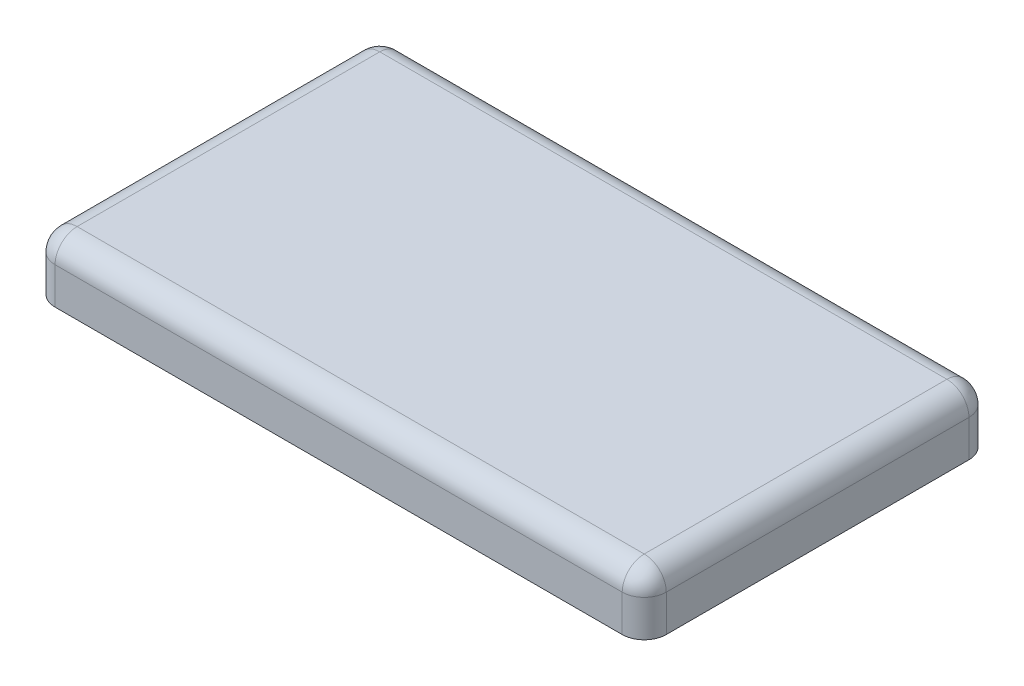
ISO-10303-21;
HEADER;
FILE_DESCRIPTION(('STEP AP214'),'2;1');
FILE_NAME('part.step','',(''),(''),'','','');
FILE_SCHEMA(('AUTOMOTIVE_DESIGN { 1 0 10303 214 1 1 1 1 }'));
ENDSEC;
DATA;
#1=APPLICATION_CONTEXT('core data for automotive mechanical design processes');
#2=APPLICATION_PROTOCOL_DEFINITION('international standard','automotive_design',2000,#1);
#3=PRODUCT_CONTEXT('',#1,'mechanical');
#4=PRODUCT('Part','Part','',(#3));
#5=PRODUCT_RELATED_PRODUCT_CATEGORY('part','',(#4));
#6=PRODUCT_DEFINITION_FORMATION('','',#4);
#7=PRODUCT_DEFINITION_CONTEXT('part definition',#1,'design');
#8=PRODUCT_DEFINITION('design','',#6,#7);
#9=PRODUCT_DEFINITION_SHAPE('','',#8);
#10=(LENGTH_UNIT() NAMED_UNIT(*) SI_UNIT(.MILLI.,.METRE.));
#11=(NAMED_UNIT(*) PLANE_ANGLE_UNIT() SI_UNIT($,.RADIAN.));
#12=(NAMED_UNIT(*) SI_UNIT($,.STERADIAN.) SOLID_ANGLE_UNIT());
#13=UNCERTAINTY_MEASURE_WITH_UNIT(LENGTH_MEASURE(1.E-05),#10,'distance_accuracy_value','');
#14=(GEOMETRIC_REPRESENTATION_CONTEXT(3) GLOBAL_UNCERTAINTY_ASSIGNED_CONTEXT((#13)) GLOBAL_UNIT_ASSIGNED_CONTEXT((#10,
#11,#12)) REPRESENTATION_CONTEXT('',''));
#15=CARTESIAN_POINT('',(0.,0.,0.));
#16=DIRECTION('',(0.,0.,1.));
#17=DIRECTION('',(1.,0.,0.));
#18=AXIS2_PLACEMENT_3D('',#15,#16,#17);
#19=CARTESIAN_POINT('',(0.,4.,0.));
#20=DIRECTION('',(1.,0.,0.));
#21=DIRECTION('',(0.,0.,-1.));
#22=AXIS2_PLACEMENT_3D('',#19,#20,#21);
#23=PLANE('',#22);
#24=DIRECTION('',(0.,0.,1.));
#25=VECTOR('',#24,1.);
#26=CARTESIAN_POINT('',(0.,0.,0.));
#27=LINE('',#26,#25);
#28=CARTESIAN_POINT('',(0.,0.,-22.1));
#29=VERTEX_POINT('',#28);
#30=CARTESIAN_POINT('',(0.,0.,-1.5));
#31=VERTEX_POINT('',#30);
#32=EDGE_CURVE('E175',#29,#31,#27,.T.);
#33=ORIENTED_EDGE('',*,*,#32,.T.);
#34=DIRECTION('',(0.,-1.,0.));
#35=VECTOR('',#34,1.);
#36=CARTESIAN_POINT('',(0.,4.,-1.5));
#37=LINE('',#36,#35);
#38=CARTESIAN_POINT('',(0.,2.5,-1.5));
#39=VERTEX_POINT('',#38);
#40=EDGE_CURVE('E51',#31,#39,#37,.F.);
#41=ORIENTED_EDGE('',*,*,#40,.T.);
#42=DIRECTION('',(0.,0.,1.));
#43=VECTOR('',#42,1.);
#44=CARTESIAN_POINT('',(0.,2.5,0.));
#45=LINE('',#44,#43);
#46=CARTESIAN_POINT('',(0.,2.5,-22.1));
#47=VERTEX_POINT('',#46);
#48=EDGE_CURVE('E56',#39,#47,#45,.F.);
#49=ORIENTED_EDGE('',*,*,#48,.T.);
#50=DIRECTION('',(0.,-1.,0.));
#51=VECTOR('',#50,1.);
#52=CARTESIAN_POINT('',(0.,4.,-22.1));
#53=LINE('',#52,#51);
#54=EDGE_CURVE('E217',#47,#29,#53,.T.);
#55=ORIENTED_EDGE('',*,*,#54,.T.);
#56=EDGE_LOOP('',(#33,#41,#49,#55));
#57=FACE_BOUND('',#56,.T.);
#58=ADVANCED_FACE('F34',(#57),#23,.F.);
#59=CARTESIAN_POINT('',(0.,4.,0.));
#60=DIRECTION('',(0.,0.,-1.));
#61=DIRECTION('',(-1.,0.,0.));
#62=AXIS2_PLACEMENT_3D('',#59,#60,#61);
#63=PLANE('',#62);
#64=DIRECTION('',(1.,0.,0.));
#65=VECTOR('',#64,1.);
#66=CARTESIAN_POINT('',(0.,2.5,0.));
#67=LINE('',#66,#65);
#68=CARTESIAN_POINT('',(40.1,2.5,0.));
#69=VERTEX_POINT('',#68);
#70=CARTESIAN_POINT('',(1.5,2.5,0.));
#71=VERTEX_POINT('',#70);
#72=EDGE_CURVE('E213',#69,#71,#67,.F.);
#73=ORIENTED_EDGE('',*,*,#72,.T.);
#74=DIRECTION('',(0.,-1.,0.));
#75=VECTOR('',#74,1.);
#76=CARTESIAN_POINT('',(1.5,4.,0.));
#77=LINE('',#76,#75);
#78=CARTESIAN_POINT('',(1.5,0.,0.));
#79=VERTEX_POINT('',#78);
#80=EDGE_CURVE('E215',#71,#79,#77,.T.);
#81=ORIENTED_EDGE('',*,*,#80,.T.);
#82=DIRECTION('',(1.,0.,0.));
#83=VECTOR('',#82,1.);
#84=CARTESIAN_POINT('',(0.,0.,0.));
#85=LINE('',#84,#83);
#86=CARTESIAN_POINT('',(40.1,0.,0.));
#87=VERTEX_POINT('',#86);
#88=EDGE_CURVE('E180',#79,#87,#85,.T.);
#89=ORIENTED_EDGE('',*,*,#88,.T.);
#90=DIRECTION('',(0.,-1.,0.));
#91=VECTOR('',#90,1.);
#92=CARTESIAN_POINT('',(40.1,4.,0.));
#93=LINE('',#92,#91);
#94=EDGE_CURVE('E211',#87,#69,#93,.F.);
#95=ORIENTED_EDGE('',*,*,#94,.T.);
#96=EDGE_LOOP('',(#73,#81,#89,#95));
#97=FACE_BOUND('',#96,.T.);
#98=ADVANCED_FACE('F282',(#97),#63,.F.);
#99=CARTESIAN_POINT('',(41.6,4.,0.));
#100=DIRECTION('',(-1.,0.,0.));
#101=DIRECTION('',(0.,0.,1.));
#102=AXIS2_PLACEMENT_3D('',#99,#100,#101);
#103=PLANE('',#102);
#104=DIRECTION('',(0.,0.,-1.));
#105=VECTOR('',#104,1.);
#106=CARTESIAN_POINT('',(41.6,0.,0.));
#107=LINE('',#106,#105);
#108=CARTESIAN_POINT('',(41.6,0.,-1.5));
#109=VERTEX_POINT('',#108);
#110=CARTESIAN_POINT('',(41.6,0.,-22.1));
#111=VERTEX_POINT('',#110);
#112=EDGE_CURVE('E183',#109,#111,#107,.T.);
#113=ORIENTED_EDGE('',*,*,#112,.T.);
#114=DIRECTION('',(0.,-1.,0.));
#115=VECTOR('',#114,1.);
#116=CARTESIAN_POINT('',(41.6,4.,-22.1));
#117=LINE('',#116,#115);
#118=CARTESIAN_POINT('',(41.6,2.5,-22.1));
#119=VERTEX_POINT('',#118);
#120=EDGE_CURVE('E209',#111,#119,#117,.F.);
#121=ORIENTED_EDGE('',*,*,#120,.T.);
#122=DIRECTION('',(0.,0.,-1.));
#123=VECTOR('',#122,1.);
#124=CARTESIAN_POINT('',(41.6,2.5,0.));
#125=LINE('',#124,#123);
#126=CARTESIAN_POINT('',(41.6,2.5,-1.5));
#127=VERTEX_POINT('',#126);
#128=EDGE_CURVE('E207',#119,#127,#125,.F.);
#129=ORIENTED_EDGE('',*,*,#128,.T.);
#130=DIRECTION('',(0.,-1.,0.));
#131=VECTOR('',#130,1.);
#132=CARTESIAN_POINT('',(41.6,4.,-1.5));
#133=LINE('',#132,#131);
#134=EDGE_CURVE('E205',#127,#109,#133,.T.);
#135=ORIENTED_EDGE('',*,*,#134,.T.);
#136=EDGE_LOOP('',(#113,#121,#129,#135));
#137=FACE_BOUND('',#136,.T.);
#138=ADVANCED_FACE('F315',(#137),#103,.F.);
#139=CARTESIAN_POINT('',(0.,4.,-23.6));
#140=DIRECTION('',(0.,0.,1.));
#141=DIRECTION('',(1.,0.,0.));
#142=AXIS2_PLACEMENT_3D('',#139,#140,#141);
#143=PLANE('',#142);
#144=DIRECTION('',(-1.,0.,0.));
#145=VECTOR('',#144,1.);
#146=CARTESIAN_POINT('',(0.,0.,-23.6));
#147=LINE('',#146,#145);
#148=CARTESIAN_POINT('',(40.1,0.,-23.6));
#149=VERTEX_POINT('',#148);
#150=CARTESIAN_POINT('',(1.49999999999999,0.,-23.6));
#151=VERTEX_POINT('',#150);
#152=EDGE_CURVE('E186',#149,#151,#147,.T.);
#153=ORIENTED_EDGE('',*,*,#152,.T.);
#154=DIRECTION('',(0.,-1.,0.));
#155=VECTOR('',#154,1.);
#156=CARTESIAN_POINT('',(1.49999999999999,4.,-23.6));
#157=LINE('',#156,#155);
#158=CARTESIAN_POINT('',(1.49999999999999,2.5,-23.6));
#159=VERTEX_POINT('',#158);
#160=EDGE_CURVE('E203',#151,#159,#157,.F.);
#161=ORIENTED_EDGE('',*,*,#160,.T.);
#162=DIRECTION('',(-1.,0.,0.));
#163=VECTOR('',#162,1.);
#164=CARTESIAN_POINT('',(0.,2.5,-23.6));
#165=LINE('',#164,#163);
#166=CARTESIAN_POINT('',(40.1,2.5,-23.6));
#167=VERTEX_POINT('',#166);
#168=EDGE_CURVE('E200',#159,#167,#165,.F.);
#169=ORIENTED_EDGE('',*,*,#168,.T.);
#170=DIRECTION('',(0.,-1.,0.));
#171=VECTOR('',#170,1.);
#172=CARTESIAN_POINT('',(40.1,4.,-23.6));
#173=LINE('',#172,#171);
#174=EDGE_CURVE('E198',#167,#149,#173,.T.);
#175=ORIENTED_EDGE('',*,*,#174,.T.);
#176=EDGE_LOOP('',(#153,#161,#169,#175));
#177=FACE_BOUND('',#176,.T.);
#178=ADVANCED_FACE('F306',(#177),#143,.F.);
#179=CARTESIAN_POINT('',(0.,4.,0.));
#180=DIRECTION('',(0.,-1.,0.));
#181=DIRECTION('',(0.,0.,-1.));
#182=AXIS2_PLACEMENT_3D('',#179,#180,#181);
#183=PLANE('',#182);
#184=DIRECTION('',(0.,0.,-1.));
#185=VECTOR('',#184,1.);
#186=CARTESIAN_POINT('',(40.1,4.,0.));
#187=LINE('',#186,#185);
#188=CARTESIAN_POINT('',(40.1,4.,-1.5));
#189=VERTEX_POINT('',#188);
#190=CARTESIAN_POINT('',(40.1,4.,-22.1));
#191=VERTEX_POINT('',#190);
#192=EDGE_CURVE('E193',#189,#191,#187,.T.);
#193=ORIENTED_EDGE('',*,*,#192,.T.);
#194=DIRECTION('',(-1.,0.,0.));
#195=VECTOR('',#194,1.);
#196=CARTESIAN_POINT('',(0.,4.,-22.1));
#197=LINE('',#196,#195);
#198=CARTESIAN_POINT('',(1.49999999999999,4.,-22.1));
#199=VERTEX_POINT('',#198);
#200=EDGE_CURVE('E195',#191,#199,#197,.T.);
#201=ORIENTED_EDGE('',*,*,#200,.T.);
#202=DIRECTION('',(0.,0.,1.));
#203=VECTOR('',#202,1.);
#204=CARTESIAN_POINT('',(1.5,4.,0.));
#205=LINE('',#204,#203);
#206=CARTESIAN_POINT('',(1.5,4.,-1.5));
#207=VERTEX_POINT('',#206);
#208=EDGE_CURVE('E189',#199,#207,#205,.T.);
#209=ORIENTED_EDGE('',*,*,#208,.T.);
#210=DIRECTION('',(1.,0.,0.));
#211=VECTOR('',#210,1.);
#212=CARTESIAN_POINT('',(0.,4.,-1.5));
#213=LINE('',#212,#211);
#214=EDGE_CURVE('E191',#207,#189,#213,.T.);
#215=ORIENTED_EDGE('',*,*,#214,.T.);
#216=EDGE_LOOP('',(#193,#201,#209,#215));
#217=FACE_BOUND('',#216,.T.);
#218=ADVANCED_FACE('F272',(#217),#183,.F.);
#219=CARTESIAN_POINT('',(0.,0.,0.));
#220=DIRECTION('',(0.,-1.,0.));
#221=DIRECTION('',(0.,0.,-1.));
#222=AXIS2_PLACEMENT_3D('',#219,#220,#221);
#223=PLANE('',#222);
#224=DIRECTION('',(0.,0.,1.));
#225=VECTOR('',#224,1.);
#226=CARTESIAN_POINT('',(40.25,0.,-22.25));
#227=LINE('',#226,#225);
#228=CARTESIAN_POINT('',(40.25,0.,-22.25));
#229=VERTEX_POINT('',#228);
#230=CARTESIAN_POINT('',(40.25,0.,-1.35));
#231=VERTEX_POINT('',#230);
#232=EDGE_CURVE('E143',#229,#231,#227,.T.);
#233=ORIENTED_EDGE('',*,*,#232,.F.);
#234=DIRECTION('',(1.,0.,0.));
#235=VECTOR('',#234,1.);
#236=CARTESIAN_POINT('',(1.34999999999999,0.,-22.25));
#237=LINE('',#236,#235);
#238=CARTESIAN_POINT('',(1.34999999999999,0.,-22.25));
#239=VERTEX_POINT('',#238);
#240=EDGE_CURVE('E160',#239,#229,#237,.T.);
#241=ORIENTED_EDGE('',*,*,#240,.F.);
#242=DIRECTION('',(0.,0.,-1.));
#243=VECTOR('',#242,1.);
#244=CARTESIAN_POINT('',(1.34999999999999,0.,-22.25));
#245=LINE('',#244,#243);
#246=CARTESIAN_POINT('',(1.34999999999999,0.,-1.35));
#247=VERTEX_POINT('',#246);
#248=EDGE_CURVE('E163',#247,#239,#245,.T.);
#249=ORIENTED_EDGE('',*,*,#248,.F.);
#250=DIRECTION('',(-1.,0.,0.));
#251=VECTOR('',#250,1.);
#252=CARTESIAN_POINT('',(1.34999999999999,0.,-1.35));
#253=LINE('',#252,#251);
#254=EDGE_CURVE('E169',#231,#247,#253,.T.);
#255=ORIENTED_EDGE('',*,*,#254,.F.);
#256=EDGE_LOOP('',(#233,#241,#249,#255));
#257=FACE_BOUND('',#256,.T.);
#258=ORIENTED_EDGE('',*,*,#88,.F.);
#259=CARTESIAN_POINT('',(1.5,0.,-1.5));
#260=DIRECTION('',(0.,-1.,0.));
#261=DIRECTION('',(0.,0.,-1.));
#262=AXIS2_PLACEMENT_3D('',#259,#260,#261);
#263=CIRCLE('',#262,1.5);
#264=EDGE_CURVE('E11',#79,#31,#263,.T.);
#265=ORIENTED_EDGE('',*,*,#264,.T.);
#266=ORIENTED_EDGE('',*,*,#32,.F.);
#267=CARTESIAN_POINT('',(1.49999999999999,0.,-22.1));
#268=DIRECTION('',(0.,-1.,0.));
#269=DIRECTION('',(0.,0.,-1.));
#270=AXIS2_PLACEMENT_3D('',#267,#268,#269);
#271=CIRCLE('',#270,1.5);
#272=EDGE_CURVE('E43',#29,#151,#271,.T.);
#273=ORIENTED_EDGE('',*,*,#272,.T.);
#274=ORIENTED_EDGE('',*,*,#152,.F.);
#275=CARTESIAN_POINT('',(40.1,0.,-22.1));
#276=DIRECTION('',(0.,-1.,0.));
#277=DIRECTION('',(0.,0.,-1.));
#278=AXIS2_PLACEMENT_3D('',#275,#276,#277);
#279=CIRCLE('',#278,1.5);
#280=EDGE_CURVE('E223',#149,#111,#279,.T.);
#281=ORIENTED_EDGE('',*,*,#280,.T.);
#282=ORIENTED_EDGE('',*,*,#112,.F.);
#283=CARTESIAN_POINT('',(40.1,0.,-1.5));
#284=DIRECTION('',(0.,-1.,0.));
#285=DIRECTION('',(0.,0.,-1.));
#286=AXIS2_PLACEMENT_3D('',#283,#284,#285);
#287=CIRCLE('',#286,1.5);
#288=EDGE_CURVE('E221',#109,#87,#287,.T.);
#289=ORIENTED_EDGE('',*,*,#288,.T.);
#290=EDGE_LOOP('',(#258,#265,#266,#273,#274,#281,#282,#289));
#291=FACE_BOUND('',#290,.T.);
#292=ADVANCED_FACE('F290',(#257,#291),#223,.T.);
#293=CARTESIAN_POINT('',(40.25,2.6,-22.25));
#294=DIRECTION('',(1.,0.,0.));
#295=DIRECTION('',(0.,0.,-1.));
#296=AXIS2_PLACEMENT_3D('',#293,#294,#295);
#297=PLANE('',#296);
#298=ORIENTED_EDGE('',*,*,#232,.T.);
#299=DIRECTION('',(0.,-1.,0.));
#300=VECTOR('',#299,1.);
#301=CARTESIAN_POINT('',(40.25,2.6,-1.35));
#302=LINE('',#301,#300);
#303=CARTESIAN_POINT('',(40.25,2.6,-1.35));
#304=VERTEX_POINT('',#303);
#305=EDGE_CURVE('E136',#304,#231,#302,.T.);
#306=ORIENTED_EDGE('',*,*,#305,.F.);
#307=DIRECTION('',(0.,0.,1.));
#308=VECTOR('',#307,1.);
#309=CARTESIAN_POINT('',(40.25,2.6,-22.25));
#310=LINE('',#309,#308);
#311=CARTESIAN_POINT('',(40.25,2.6,-22.25));
#312=VERTEX_POINT('',#311);
#313=EDGE_CURVE('E140',#312,#304,#310,.T.);
#314=ORIENTED_EDGE('',*,*,#313,.F.);
#315=DIRECTION('',(0.,-1.,0.));
#316=VECTOR('',#315,1.);
#317=CARTESIAN_POINT('',(40.25,2.6,-22.25));
#318=LINE('',#317,#316);
#319=EDGE_CURVE('E173',#312,#229,#318,.T.);
#320=ORIENTED_EDGE('',*,*,#319,.T.);
#321=EDGE_LOOP('',(#298,#306,#314,#320));
#322=FACE_BOUND('',#321,.T.);
#323=ADVANCED_FACE('F138',(#322),#297,.F.);
#324=CARTESIAN_POINT('',(1.34999999999999,2.6,-22.25));
#325=DIRECTION('',(0.,0.,-1.));
#326=DIRECTION('',(-1.,0.,0.));
#327=AXIS2_PLACEMENT_3D('',#324,#325,#326);
#328=PLANE('',#327);
#329=ORIENTED_EDGE('',*,*,#240,.T.);
#330=ORIENTED_EDGE('',*,*,#319,.F.);
#331=DIRECTION('',(1.,0.,0.));
#332=VECTOR('',#331,1.);
#333=CARTESIAN_POINT('',(1.34999999999999,2.6,-22.25));
#334=LINE('',#333,#332);
#335=CARTESIAN_POINT('',(1.34999999999999,2.6,-22.25));
#336=VERTEX_POINT('',#335);
#337=EDGE_CURVE('E148',#336,#312,#334,.T.);
#338=ORIENTED_EDGE('',*,*,#337,.F.);
#339=DIRECTION('',(0.,-1.,0.));
#340=VECTOR('',#339,1.);
#341=CARTESIAN_POINT('',(1.34999999999999,2.6,-22.25));
#342=LINE('',#341,#340);
#343=EDGE_CURVE('E176',#336,#239,#342,.T.);
#344=ORIENTED_EDGE('',*,*,#343,.T.);
#345=EDGE_LOOP('',(#329,#330,#338,#344));
#346=FACE_BOUND('',#345,.T.);
#347=ADVANCED_FACE('F444',(#346),#328,.F.);
#348=CARTESIAN_POINT('',(1.34999999999999,2.6,-22.25));
#349=DIRECTION('',(-1.,0.,0.));
#350=DIRECTION('',(0.,0.,1.));
#351=AXIS2_PLACEMENT_3D('',#348,#349,#350);
#352=PLANE('',#351);
#353=ORIENTED_EDGE('',*,*,#248,.T.);
#354=ORIENTED_EDGE('',*,*,#343,.F.);
#355=DIRECTION('',(0.,0.,-1.));
#356=VECTOR('',#355,1.);
#357=CARTESIAN_POINT('',(1.34999999999999,2.6,-22.25));
#358=LINE('',#357,#356);
#359=CARTESIAN_POINT('',(1.34999999999999,2.6,-1.35));
#360=VERTEX_POINT('',#359);
#361=EDGE_CURVE('E156',#360,#336,#358,.T.);
#362=ORIENTED_EDGE('',*,*,#361,.F.);
#363=DIRECTION('',(0.,-1.,0.));
#364=VECTOR('',#363,1.);
#365=CARTESIAN_POINT('',(1.34999999999999,2.6,-1.35));
#366=LINE('',#365,#364);
#367=EDGE_CURVE('E147',#360,#247,#366,.T.);
#368=ORIENTED_EDGE('',*,*,#367,.T.);
#369=EDGE_LOOP('',(#353,#354,#362,#368));
#370=FACE_BOUND('',#369,.T.);
#371=ADVANCED_FACE('F436',(#370),#352,.F.);
#372=CARTESIAN_POINT('',(1.34999999999999,2.6,-1.35));
#373=DIRECTION('',(0.,0.,1.));
#374=DIRECTION('',(1.,0.,0.));
#375=AXIS2_PLACEMENT_3D('',#372,#373,#374);
#376=PLANE('',#375);
#377=ORIENTED_EDGE('',*,*,#254,.T.);
#378=ORIENTED_EDGE('',*,*,#367,.F.);
#379=DIRECTION('',(-1.,0.,0.));
#380=VECTOR('',#379,1.);
#381=CARTESIAN_POINT('',(1.34999999999999,2.6,-1.35));
#382=LINE('',#381,#380);
#383=EDGE_CURVE('E151',#304,#360,#382,.T.);
#384=ORIENTED_EDGE('',*,*,#383,.F.);
#385=ORIENTED_EDGE('',*,*,#305,.T.);
#386=EDGE_LOOP('',(#377,#378,#384,#385));
#387=FACE_BOUND('',#386,.T.);
#388=ADVANCED_FACE('F152',(#387),#376,.F.);
#389=CARTESIAN_POINT('',(0.,2.6,0.));
#390=DIRECTION('',(0.,1.,0.));
#391=DIRECTION('',(0.,0.,1.));
#392=AXIS2_PLACEMENT_3D('',#389,#390,#391);
#393=PLANE('',#392);
#394=ORIENTED_EDGE('',*,*,#313,.T.);
#395=ORIENTED_EDGE('',*,*,#383,.T.);
#396=ORIENTED_EDGE('',*,*,#361,.T.);
#397=ORIENTED_EDGE('',*,*,#337,.T.);
#398=EDGE_LOOP('',(#394,#395,#396,#397));
#399=FACE_BOUND('',#398,.T.);
#400=ADVANCED_FACE('F158',(#399),#393,.F.);
#401=CARTESIAN_POINT('',(40.1,4.,-1.5));
#402=DIRECTION('',(0.,-1.,0.));
#403=DIRECTION('',(0.,0.,-1.));
#404=AXIS2_PLACEMENT_3D('',#401,#402,#403);
#405=CYLINDRICAL_SURFACE('',#404,1.5);
#406=ORIENTED_EDGE('',*,*,#288,.F.);
#407=ORIENTED_EDGE('',*,*,#134,.F.);
#408=CARTESIAN_POINT('',(40.1,2.5,-1.5));
#409=DIRECTION('',(0.,1.,0.));
#410=DIRECTION('',(0.,0.,1.));
#411=AXIS2_PLACEMENT_3D('',#408,#409,#410);
#412=CIRCLE('',#411,1.5);
#413=EDGE_CURVE('E38',#69,#127,#412,.T.);
#414=ORIENTED_EDGE('',*,*,#413,.F.);
#415=ORIENTED_EDGE('',*,*,#94,.F.);
#416=EDGE_LOOP('',(#406,#407,#414,#415));
#417=FACE_BOUND('',#416,.T.);
#418=ADVANCED_FACE('F36',(#417),#405,.T.);
#419=CARTESIAN_POINT('',(0.,2.5,-1.5));
#420=DIRECTION('',(1.,0.,0.));
#421=DIRECTION('',(0.,0.,-1.));
#422=AXIS2_PLACEMENT_3D('',#419,#420,#421);
#423=CYLINDRICAL_SURFACE('',#422,1.5);
#424=CARTESIAN_POINT('',(1.5,2.5,-1.5));
#425=DIRECTION('',(-1.,0.,0.));
#426=DIRECTION('',(0.,0.,1.));
#427=AXIS2_PLACEMENT_3D('',#424,#425,#426);
#428=CIRCLE('',#427,1.5);
#429=EDGE_CURVE('E251',#71,#207,#428,.T.);
#430=ORIENTED_EDGE('',*,*,#429,.F.);
#431=ORIENTED_EDGE('',*,*,#72,.F.);
#432=CARTESIAN_POINT('',(40.1,2.5,-1.5));
#433=DIRECTION('',(1.,0.,0.));
#434=DIRECTION('',(0.,0.,-1.));
#435=AXIS2_PLACEMENT_3D('',#432,#433,#434);
#436=CIRCLE('',#435,1.5);
#437=EDGE_CURVE('E253',#189,#69,#436,.T.);
#438=ORIENTED_EDGE('',*,*,#437,.F.);
#439=ORIENTED_EDGE('',*,*,#214,.F.);
#440=EDGE_LOOP('',(#430,#431,#438,#439));
#441=FACE_BOUND('',#440,.T.);
#442=ADVANCED_FACE('F279',(#441),#423,.T.);
#443=CARTESIAN_POINT('',(1.5,4.,-1.5));
#444=DIRECTION('',(0.,-1.,0.));
#445=DIRECTION('',(0.,0.,-1.));
#446=AXIS2_PLACEMENT_3D('',#443,#444,#445);
#447=CYLINDRICAL_SURFACE('',#446,1.5);
#448=ORIENTED_EDGE('',*,*,#264,.F.);
#449=ORIENTED_EDGE('',*,*,#80,.F.);
#450=CARTESIAN_POINT('',(1.5,2.5,-1.5));
#451=DIRECTION('',(0.,1.,0.));
#452=DIRECTION('',(0.,0.,1.));
#453=AXIS2_PLACEMENT_3D('',#450,#451,#452);
#454=CIRCLE('',#453,1.5);
#455=EDGE_CURVE('E248',#39,#71,#454,.T.);
#456=ORIENTED_EDGE('',*,*,#455,.F.);
#457=ORIENTED_EDGE('',*,*,#40,.F.);
#458=EDGE_LOOP('',(#448,#449,#456,#457));
#459=FACE_BOUND('',#458,.T.);
#460=ADVANCED_FACE('F286',(#459),#447,.T.);
#461=CARTESIAN_POINT('',(40.1,2.5,-1.5));
#462=DIRECTION('',(0.,0.,1.));
#463=DIRECTION('',(1.,0.,0.));
#464=AXIS2_PLACEMENT_3D('',#461,#462,#463);
#465=SPHERICAL_SURFACE('',#464,1.5);
#466=ORIENTED_EDGE('',*,*,#437,.T.);
#467=ORIENTED_EDGE('',*,*,#413,.T.);
#468=CARTESIAN_POINT('',(40.1,2.5,-1.5));
#469=DIRECTION('',(0.,0.,1.));
#470=DIRECTION('',(1.,0.,0.));
#471=AXIS2_PLACEMENT_3D('',#468,#469,#470);
#472=CIRCLE('',#471,1.5);
#473=EDGE_CURVE('E245',#189,#127,#472,.F.);
#474=ORIENTED_EDGE('',*,*,#473,.F.);
#475=EDGE_LOOP('',(#466,#467,#474));
#476=FACE_BOUND('',#475,.T.);
#477=ADVANCED_FACE('F260',(#476),#465,.T.);
#478=CARTESIAN_POINT('',(1.5,2.5,-1.5));
#479=DIRECTION('',(0.,0.,1.));
#480=DIRECTION('',(1.,0.,0.));
#481=AXIS2_PLACEMENT_3D('',#478,#479,#480);
#482=SPHERICAL_SURFACE('',#481,1.5);
#483=ORIENTED_EDGE('',*,*,#455,.T.);
#484=ORIENTED_EDGE('',*,*,#429,.T.);
#485=CARTESIAN_POINT('',(1.5,2.5,-1.5));
#486=DIRECTION('',(0.,0.,1.));
#487=DIRECTION('',(1.,0.,0.));
#488=AXIS2_PLACEMENT_3D('',#485,#486,#487);
#489=CIRCLE('',#488,1.5);
#490=EDGE_CURVE('E242',#39,#207,#489,.F.);
#491=ORIENTED_EDGE('',*,*,#490,.F.);
#492=EDGE_LOOP('',(#483,#484,#491));
#493=FACE_BOUND('',#492,.T.);
#494=ADVANCED_FACE('F347',(#493),#482,.T.);
#495=CARTESIAN_POINT('',(40.1,4.,-22.1));
#496=DIRECTION('',(0.,-1.,0.));
#497=DIRECTION('',(0.,0.,-1.));
#498=AXIS2_PLACEMENT_3D('',#495,#496,#497);
#499=CYLINDRICAL_SURFACE('',#498,1.5);
#500=ORIENTED_EDGE('',*,*,#280,.F.);
#501=ORIENTED_EDGE('',*,*,#174,.F.);
#502=CARTESIAN_POINT('',(40.1,2.5,-22.1));
#503=DIRECTION('',(0.,1.,0.));
#504=DIRECTION('',(0.,0.,1.));
#505=AXIS2_PLACEMENT_3D('',#502,#503,#504);
#506=CIRCLE('',#505,1.5);
#507=EDGE_CURVE('E239',#119,#167,#506,.T.);
#508=ORIENTED_EDGE('',*,*,#507,.F.);
#509=ORIENTED_EDGE('',*,*,#120,.F.);
#510=EDGE_LOOP('',(#500,#501,#508,#509));
#511=FACE_BOUND('',#510,.T.);
#512=ADVANCED_FACE('F313',(#511),#499,.T.);
#513=CARTESIAN_POINT('',(40.1,2.5,0.));
#514=DIRECTION('',(0.,0.,-1.));
#515=DIRECTION('',(-1.,0.,0.));
#516=AXIS2_PLACEMENT_3D('',#513,#514,#515);
#517=CYLINDRICAL_SURFACE('',#516,1.5);
#518=ORIENTED_EDGE('',*,*,#473,.T.);
#519=ORIENTED_EDGE('',*,*,#128,.F.);
#520=CARTESIAN_POINT('',(40.1,2.5,-22.1));
#521=DIRECTION('',(0.,0.,-1.));
#522=DIRECTION('',(-1.,0.,0.));
#523=AXIS2_PLACEMENT_3D('',#520,#521,#522);
#524=CIRCLE('',#523,1.5);
#525=EDGE_CURVE('E236',#191,#119,#524,.T.);
#526=ORIENTED_EDGE('',*,*,#525,.F.);
#527=ORIENTED_EDGE('',*,*,#192,.F.);
#528=EDGE_LOOP('',(#518,#519,#526,#527));
#529=FACE_BOUND('',#528,.T.);
#530=ADVANCED_FACE('F267',(#529),#517,.T.);
#531=CARTESIAN_POINT('',(1.5,2.5,0.));
#532=DIRECTION('',(0.,0.,1.));
#533=DIRECTION('',(1.,0.,0.));
#534=AXIS2_PLACEMENT_3D('',#531,#532,#533);
#535=CYLINDRICAL_SURFACE('',#534,1.5);
#536=ORIENTED_EDGE('',*,*,#490,.T.);
#537=ORIENTED_EDGE('',*,*,#208,.F.);
#538=CARTESIAN_POINT('',(1.49999999999999,2.5,-22.1));
#539=DIRECTION('',(0.,0.,-1.));
#540=DIRECTION('',(-1.,0.,0.));
#541=AXIS2_PLACEMENT_3D('',#538,#539,#540);
#542=CIRCLE('',#541,1.5);
#543=EDGE_CURVE('E233',#47,#199,#542,.T.);
#544=ORIENTED_EDGE('',*,*,#543,.F.);
#545=ORIENTED_EDGE('',*,*,#48,.F.);
#546=EDGE_LOOP('',(#536,#537,#544,#545));
#547=FACE_BOUND('',#546,.T.);
#548=ADVANCED_FACE('F299',(#547),#535,.T.);
#549=CARTESIAN_POINT('',(1.49999999999999,4.,-22.1));
#550=DIRECTION('',(0.,-1.,0.));
#551=DIRECTION('',(0.,0.,-1.));
#552=AXIS2_PLACEMENT_3D('',#549,#550,#551);
#553=CYLINDRICAL_SURFACE('',#552,1.5);
#554=ORIENTED_EDGE('',*,*,#272,.F.);
#555=ORIENTED_EDGE('',*,*,#54,.F.);
#556=CARTESIAN_POINT('',(1.49999999999999,2.5,-22.1));
#557=DIRECTION('',(0.,1.,0.));
#558=DIRECTION('',(0.,0.,1.));
#559=AXIS2_PLACEMENT_3D('',#556,#557,#558);
#560=CIRCLE('',#559,1.5);
#561=EDGE_CURVE('E230',#159,#47,#560,.T.);
#562=ORIENTED_EDGE('',*,*,#561,.F.);
#563=ORIENTED_EDGE('',*,*,#160,.F.);
#564=EDGE_LOOP('',(#554,#555,#562,#563));
#565=FACE_BOUND('',#564,.T.);
#566=ADVANCED_FACE('F295',(#565),#553,.T.);
#567=CARTESIAN_POINT('',(40.1,2.5,-22.1));
#568=DIRECTION('',(0.,0.,1.));
#569=DIRECTION('',(1.,0.,0.));
#570=AXIS2_PLACEMENT_3D('',#567,#568,#569);
#571=SPHERICAL_SURFACE('',#570,1.5);
#572=ORIENTED_EDGE('',*,*,#525,.T.);
#573=ORIENTED_EDGE('',*,*,#507,.T.);
#574=CARTESIAN_POINT('',(40.1,2.5,-22.1));
#575=DIRECTION('',(1.,0.,0.));
#576=DIRECTION('',(0.,0.,-1.));
#577=AXIS2_PLACEMENT_3D('',#574,#575,#576);
#578=CIRCLE('',#577,1.5);
#579=EDGE_CURVE('E228',#191,#167,#578,.F.);
#580=ORIENTED_EDGE('',*,*,#579,.F.);
#581=EDGE_LOOP('',(#572,#573,#580));
#582=FACE_BOUND('',#581,.T.);
#583=ADVANCED_FACE('F335',(#582),#571,.T.);
#584=CARTESIAN_POINT('',(1.49999999999999,2.5,-22.1));
#585=DIRECTION('',(0.,0.,1.));
#586=DIRECTION('',(1.,0.,0.));
#587=AXIS2_PLACEMENT_3D('',#584,#585,#586);
#588=SPHERICAL_SURFACE('',#587,1.5);
#589=ORIENTED_EDGE('',*,*,#561,.T.);
#590=ORIENTED_EDGE('',*,*,#543,.T.);
#591=CARTESIAN_POINT('',(1.49999999999999,2.5,-22.1));
#592=DIRECTION('',(-1.,0.,0.));
#593=DIRECTION('',(0.,0.,1.));
#594=AXIS2_PLACEMENT_3D('',#591,#592,#593);
#595=CIRCLE('',#594,1.5);
#596=EDGE_CURVE('E226',#159,#199,#595,.F.);
#597=ORIENTED_EDGE('',*,*,#596,.F.);
#598=EDGE_LOOP('',(#589,#590,#597));
#599=FACE_BOUND('',#598,.T.);
#600=ADVANCED_FACE('F302',(#599),#588,.T.);
#601=CARTESIAN_POINT('',(0.,2.5,-22.1));
#602=DIRECTION('',(-1.,0.,0.));
#603=DIRECTION('',(0.,0.,1.));
#604=AXIS2_PLACEMENT_3D('',#601,#602,#603);
#605=CYLINDRICAL_SURFACE('',#604,1.5);
#606=ORIENTED_EDGE('',*,*,#579,.T.);
#607=ORIENTED_EDGE('',*,*,#168,.F.);
#608=ORIENTED_EDGE('',*,*,#596,.T.);
#609=ORIENTED_EDGE('',*,*,#200,.F.);
#610=EDGE_LOOP('',(#606,#607,#608,#609));
#611=FACE_BOUND('',#610,.T.);
#612=ADVANCED_FACE('F304',(#611),#605,.T.);
#613=CLOSED_SHELL('',(#58,#98,#138,#178,#218,#292,#323,#347,#371,#388,#400,#418,#442,#460,#477,
#494,#512,#530,#548,#566,#583,#600,#612));
#614=MANIFOLD_SOLID_BREP('B2',#613);
#615=ADVANCED_BREP_SHAPE_REPRESENTATION('',(#18,#614),#14);
#616=SHAPE_DEFINITION_REPRESENTATION(#9,#615);
ENDSEC;
END-ISO-10303-21;
